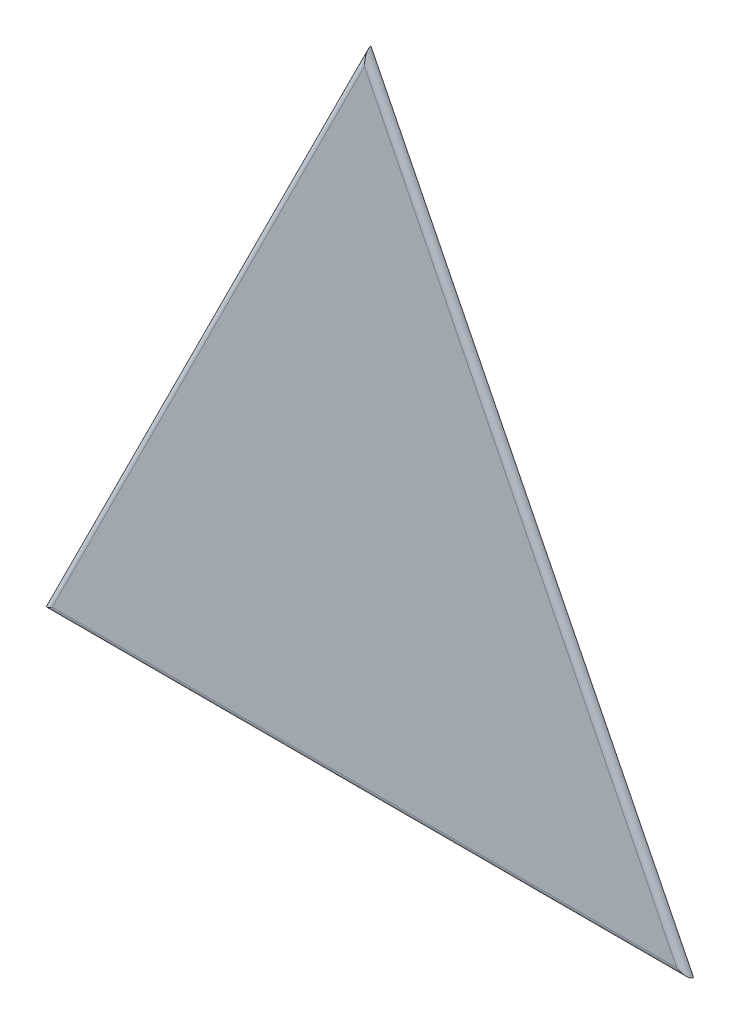
ISO-10303-21;
HEADER;
FILE_DESCRIPTION(('STEP AP214'),'2;1');
FILE_NAME('part.step','',(''),(''),'','','');
FILE_SCHEMA(('AUTOMOTIVE_DESIGN { 1 0 10303 214 1 1 1 1 }'));
ENDSEC;
DATA;
#1=APPLICATION_CONTEXT('core data for automotive mechanical design processes');
#2=APPLICATION_PROTOCOL_DEFINITION('international standard','automotive_design',2000,#1);
#3=PRODUCT_CONTEXT('',#1,'mechanical');
#4=PRODUCT('Part','Part','',(#3));
#5=PRODUCT_RELATED_PRODUCT_CATEGORY('part','',(#4));
#6=PRODUCT_DEFINITION_FORMATION('','',#4);
#7=PRODUCT_DEFINITION_CONTEXT('part definition',#1,'design');
#8=PRODUCT_DEFINITION('design','',#6,#7);
#9=PRODUCT_DEFINITION_SHAPE('','',#8);
#10=(LENGTH_UNIT() NAMED_UNIT(*) SI_UNIT(.MILLI.,.METRE.));
#11=(NAMED_UNIT(*) PLANE_ANGLE_UNIT() SI_UNIT($,.RADIAN.));
#12=(NAMED_UNIT(*) SI_UNIT($,.STERADIAN.) SOLID_ANGLE_UNIT());
#13=UNCERTAINTY_MEASURE_WITH_UNIT(LENGTH_MEASURE(1.E-05),#10,'distance_accuracy_value','');
#14=(GEOMETRIC_REPRESENTATION_CONTEXT(3) GLOBAL_UNCERTAINTY_ASSIGNED_CONTEXT((#13)) GLOBAL_UNIT_ASSIGNED_CONTEXT((#10,
#11,#12)) REPRESENTATION_CONTEXT('',''));
#15=CARTESIAN_POINT('',(0.,0.,0.));
#16=DIRECTION('',(0.,0.,1.));
#17=DIRECTION('',(1.,0.,0.));
#18=AXIS2_PLACEMENT_3D('',#15,#16,#17);
#19=CARTESIAN_POINT('',(0.,0.,1.));
#20=DIRECTION('',(0.,0.,1.));
#21=DIRECTION('',(1.,0.,0.));
#22=AXIS2_PLACEMENT_3D('',#19,#20,#21);
#23=PLANE('',#22);
#24=DIRECTION('',(-0.447213595499958,-0.894427190999916,0.));
#25=VECTOR('',#24,1.);
#26=CARTESIAN_POINT('',(-49.1055728090001,-0.447213595499953,1.));
#27=LINE('',#26,#25);
#28=CARTESIAN_POINT('',(0.,97.7639320225002,1.));
#29=VERTEX_POINT('',#28);
#30=CARTESIAN_POINT('',(-48.3819660112501,1.,1.));
#31=VERTEX_POINT('',#30);
#32=EDGE_CURVE('E42',#29,#31,#27,.T.);
#33=ORIENTED_EDGE('',*,*,#32,.T.);
#34=DIRECTION('',(1.,0.,0.));
#35=VECTOR('',#34,1.);
#36=CARTESIAN_POINT('',(50.,1.00000000000001,1.));
#37=LINE('',#36,#35);
#38=CARTESIAN_POINT('',(48.3819660112501,1.00000000000001,1.));
#39=VERTEX_POINT('',#38);
#40=EDGE_CURVE('E11',#31,#39,#37,.T.);
#41=ORIENTED_EDGE('',*,*,#40,.T.);
#42=DIRECTION('',(-0.447213595499958,0.894427190999916,0.));
#43=VECTOR('',#42,1.);
#44=CARTESIAN_POINT('',(-0.894427190999914,99.5527864045001,1.));
#45=LINE('',#44,#43);
#46=EDGE_CURVE('E52',#39,#29,#45,.T.);
#47=ORIENTED_EDGE('',*,*,#46,.T.);
#48=EDGE_LOOP('',(#33,#41,#47));
#49=FACE_BOUND('',#48,.T.);
#50=ADVANCED_FACE('F33',(#49),#23,.T.);
#51=CARTESIAN_POINT('',(0.,0.,0.));
#52=DIRECTION('',(0.,0.,1.));
#53=DIRECTION('',(1.,0.,0.));
#54=AXIS2_PLACEMENT_3D('',#51,#52,#53);
#55=PLANE('',#54);
#56=DIRECTION('',(-0.447213595499958,-0.894427190999916,0.));
#57=VECTOR('',#56,1.);
#58=CARTESIAN_POINT('',(0.,100.,0.));
#59=LINE('',#58,#57);
#60=CARTESIAN_POINT('',(0.,100.,0.));
#61=VERTEX_POINT('',#60);
#62=CARTESIAN_POINT('',(-50.,0.,0.));
#63=VERTEX_POINT('',#62);
#64=EDGE_CURVE('E76',#61,#63,#59,.T.);
#65=ORIENTED_EDGE('',*,*,#64,.F.);
#66=DIRECTION('',(-0.447213595499958,0.894427190999916,0.));
#67=VECTOR('',#66,1.);
#68=CARTESIAN_POINT('',(50.,0.,0.));
#69=LINE('',#68,#67);
#70=CARTESIAN_POINT('',(50.,0.,0.));
#71=VERTEX_POINT('',#70);
#72=EDGE_CURVE('E82',#71,#61,#69,.T.);
#73=ORIENTED_EDGE('',*,*,#72,.F.);
#74=DIRECTION('',(1.,0.,0.));
#75=VECTOR('',#74,1.);
#76=CARTESIAN_POINT('',(-50.,0.,0.));
#77=LINE('',#76,#75);
#78=EDGE_CURVE('E71',#63,#71,#77,.T.);
#79=ORIENTED_EDGE('',*,*,#78,.F.);
#80=EDGE_LOOP('',(#65,#73,#79));
#81=FACE_BOUND('',#80,.T.);
#82=ADVANCED_FACE('F81',(#81),#55,.F.);
#83=CARTESIAN_POINT('',(-39.1055728090001,19.5527864045,0.));
#84=DIRECTION('',(0.447213595499958,0.894427190999916,0.));
#85=DIRECTION('',(-0.894427190999916,0.447213595499958,0.));
#86=AXIS2_PLACEMENT_3D('',#83,#84,#85);
#87=CYLINDRICAL_SURFACE('',#86,1.);
#88=CARTESIAN_POINT('',(-48.3819660112501,1.,0.));
#89=DIRECTION('',(-0.525731112119134,0.85065080835204,0.));
#90=DIRECTION('',(0.85065080835204,0.525731112119134,0.));
#91=AXIS2_PLACEMENT_3D('',#88,#89,#90);
#92=ELLIPSE('',#91,1.90211303259031,1.);
#93=EDGE_CURVE('E67',#31,#63,#92,.F.);
#94=ORIENTED_EDGE('',*,*,#93,.F.);
#95=ORIENTED_EDGE('',*,*,#32,.F.);
#96=CARTESIAN_POINT('',(0.,97.7639320225002,0.));
#97=DIRECTION('',(1.,0.,0.));
#98=DIRECTION('',(0.,-1.,0.));
#99=AXIS2_PLACEMENT_3D('',#96,#97,#98);
#100=ELLIPSE('',#99,2.23606797749979,1.);
#101=EDGE_CURVE('E37',#61,#29,#100,.T.);
#102=ORIENTED_EDGE('',*,*,#101,.F.);
#103=ORIENTED_EDGE('',*,*,#64,.T.);
#104=EDGE_LOOP('',(#94,#95,#102,#103));
#105=FACE_BOUND('',#104,.T.);
#106=ADVANCED_FACE('F35',(#105),#87,.T.);
#107=CARTESIAN_POINT('',(39.1055728090001,19.5527864045001,0.));
#108=DIRECTION('',(0.447213595499958,-0.894427190999916,0.));
#109=DIRECTION('',(0.894427190999916,0.447213595499958,0.));
#110=AXIS2_PLACEMENT_3D('',#107,#108,#109);
#111=CYLINDRICAL_SURFACE('',#110,1.);
#112=ORIENTED_EDGE('',*,*,#101,.T.);
#113=ORIENTED_EDGE('',*,*,#46,.F.);
#114=CARTESIAN_POINT('',(48.3819660112501,1.00000000000001,0.));
#115=DIRECTION('',(-0.525731112119133,-0.85065080835204,0.));
#116=DIRECTION('',(0.85065080835204,-0.525731112119133,0.));
#117=AXIS2_PLACEMENT_3D('',#114,#115,#116);
#118=ELLIPSE('',#117,1.90211303259031,1.);
#119=EDGE_CURVE('E74',#71,#39,#118,.T.);
#120=ORIENTED_EDGE('',*,*,#119,.F.);
#121=ORIENTED_EDGE('',*,*,#72,.T.);
#122=EDGE_LOOP('',(#112,#113,#120,#121));
#123=FACE_BOUND('',#122,.T.);
#124=ADVANCED_FACE('F89',(#123),#111,.T.);
#125=CARTESIAN_POINT('',(0.,1.00000000000001,0.));
#126=DIRECTION('',(-1.,0.,0.));
#127=DIRECTION('',(0.,-1.,0.));
#128=AXIS2_PLACEMENT_3D('',#125,#126,#127);
#129=CYLINDRICAL_SURFACE('',#128,1.);
#130=ORIENTED_EDGE('',*,*,#93,.T.);
#131=ORIENTED_EDGE('',*,*,#78,.T.);
#132=ORIENTED_EDGE('',*,*,#119,.T.);
#133=ORIENTED_EDGE('',*,*,#40,.F.);
#134=EDGE_LOOP('',(#130,#131,#132,#133));
#135=FACE_BOUND('',#134,.T.);
#136=ADVANCED_FACE('F69',(#135),#129,.T.);
#137=CLOSED_SHELL('',(#50,#82,#106,#124,#136));
#138=MANIFOLD_SOLID_BREP('B2',#137);
#139=ADVANCED_BREP_SHAPE_REPRESENTATION('',(#18,#138),#14);
#140=SHAPE_DEFINITION_REPRESENTATION(#9,#139);
ENDSEC;
END-ISO-10303-21;
